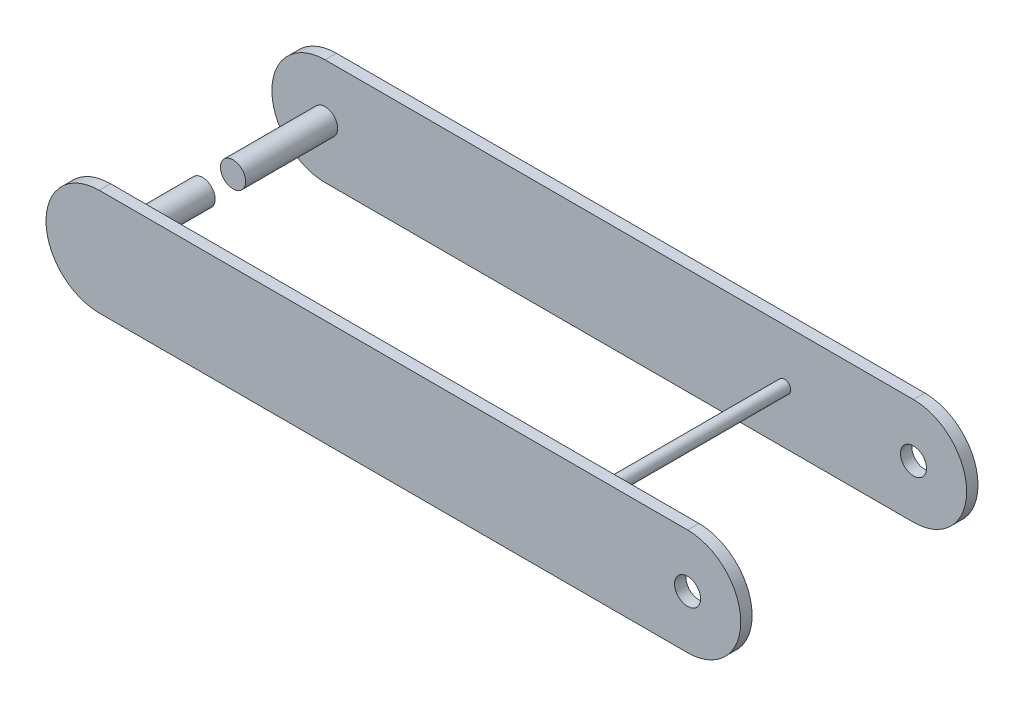
ISO-10303-21;
HEADER;
FILE_DESCRIPTION(('STEP AP214'),'2;1');
FILE_NAME('part.step','',(''),(''),'','','');
FILE_SCHEMA(('AUTOMOTIVE_DESIGN { 1 0 10303 214 1 1 1 1 }'));
ENDSEC;
DATA;
#1=APPLICATION_CONTEXT('core data for automotive mechanical design processes');
#2=APPLICATION_PROTOCOL_DEFINITION('international standard','automotive_design',2000,#1);
#3=PRODUCT_CONTEXT('',#1,'mechanical');
#4=PRODUCT('Part','Part','',(#3));
#5=PRODUCT_RELATED_PRODUCT_CATEGORY('part','',(#4));
#6=PRODUCT_DEFINITION_FORMATION('','',#4);
#7=PRODUCT_DEFINITION_CONTEXT('part definition',#1,'design');
#8=PRODUCT_DEFINITION('design','',#6,#7);
#9=PRODUCT_DEFINITION_SHAPE('','',#8);
#10=(LENGTH_UNIT() NAMED_UNIT(*) SI_UNIT(.MILLI.,.METRE.));
#11=(NAMED_UNIT(*) PLANE_ANGLE_UNIT() SI_UNIT($,.RADIAN.));
#12=(NAMED_UNIT(*) SI_UNIT($,.STERADIAN.) SOLID_ANGLE_UNIT());
#13=UNCERTAINTY_MEASURE_WITH_UNIT(LENGTH_MEASURE(1.E-05),#10,'distance_accuracy_value','');
#14=(GEOMETRIC_REPRESENTATION_CONTEXT(3) GLOBAL_UNCERTAINTY_ASSIGNED_CONTEXT((#13)) GLOBAL_UNIT_ASSIGNED_CONTEXT((#10,
#11,#12)) REPRESENTATION_CONTEXT('',''));
#15=CARTESIAN_POINT('',(0.,0.,0.));
#16=DIRECTION('',(0.,0.,1.));
#17=DIRECTION('',(1.,0.,0.));
#18=AXIS2_PLACEMENT_3D('',#15,#16,#17);
#19=CARTESIAN_POINT('',(-149.578947368421,-25.3,5.4));
#20=DIRECTION('',(0.,0.,1.));
#21=DIRECTION('',(1.,0.,0.));
#22=AXIS2_PLACEMENT_3D('',#19,#20,#21);
#23=PLANE('',#22);
#24=DIRECTION('',(-1.,0.,0.));
#25=VECTOR('',#24,1.);
#26=CARTESIAN_POINT('',(130.421052631579,0.,5.4));
#27=LINE('',#26,#25);
#28=CARTESIAN_POINT('',(130.421052631579,0.,5.4));
#29=VERTEX_POINT('',#28);
#30=CARTESIAN_POINT('',(-149.578947368421,0.,5.4));
#31=VERTEX_POINT('',#30);
#32=EDGE_CURVE('E83',#29,#31,#27,.T.);
#33=ORIENTED_EDGE('',*,*,#32,.T.);
#34=CARTESIAN_POINT('',(-149.578947368421,-25.3,5.4));
#35=DIRECTION('',(0.,0.,1.));
#36=DIRECTION('',(1.,0.,0.));
#37=AXIS2_PLACEMENT_3D('',#34,#35,#36);
#38=CIRCLE('',#37,25.3);
#39=CARTESIAN_POINT('',(-149.578947368421,-50.6,5.4));
#40=VERTEX_POINT('',#39);
#41=EDGE_CURVE('E152',#31,#40,#38,.T.);
#42=ORIENTED_EDGE('',*,*,#41,.T.);
#43=DIRECTION('',(1.,0.,0.));
#44=VECTOR('',#43,1.);
#45=CARTESIAN_POINT('',(-149.578947368421,-50.6,5.4));
#46=LINE('',#45,#44);
#47=CARTESIAN_POINT('',(130.421052631579,-50.6,5.4));
#48=VERTEX_POINT('',#47);
#49=EDGE_CURVE('E155',#40,#48,#46,.T.);
#50=ORIENTED_EDGE('',*,*,#49,.T.);
#51=CARTESIAN_POINT('',(130.421052631579,-25.3,5.4));
#52=DIRECTION('',(0.,0.,1.));
#53=DIRECTION('',(1.,0.,0.));
#54=AXIS2_PLACEMENT_3D('',#51,#52,#53);
#55=CIRCLE('',#54,25.3);
#56=EDGE_CURVE('E53',#48,#29,#55,.T.);
#57=ORIENTED_EDGE('',*,*,#56,.T.);
#58=EDGE_LOOP('',(#33,#42,#50,#57));
#59=FACE_BOUND('',#58,.T.);
#60=CARTESIAN_POINT('',(130.421052631579,-25.3,5.4));
#61=DIRECTION('',(0.,0.,1.));
#62=DIRECTION('',(1.,0.,0.));
#63=AXIS2_PLACEMENT_3D('',#60,#61,#62);
#64=CIRCLE('',#63,6.2);
#65=CARTESIAN_POINT('',(124.221052631579,-25.3,5.4));
#66=VERTEX_POINT('',#65);
#67=EDGE_CURVE('E146',#66,#66,#64,.T.);
#68=ORIENTED_EDGE('',*,*,#67,.F.);
#69=EDGE_LOOP('',(#68));
#70=FACE_BOUND('',#69,.T.);
#71=ADVANCED_FACE('F36',(#59,#70),#23,.T.);
#72=CARTESIAN_POINT('',(-149.578947368421,-25.3,0.));
#73=DIRECTION('',(0.,0.,1.));
#74=DIRECTION('',(1.,0.,0.));
#75=AXIS2_PLACEMENT_3D('',#72,#73,#74);
#76=PLANE('',#75);
#77=CARTESIAN_POINT('',(-149.578947368421,-25.3,0.));
#78=DIRECTION('',(0.,0.,1.));
#79=DIRECTION('',(1.,0.,0.));
#80=AXIS2_PLACEMENT_3D('',#77,#78,#79);
#81=CIRCLE('',#80,6.00000000000002);
#82=CARTESIAN_POINT('',(-143.578947368421,-25.3,0.));
#83=VERTEX_POINT('',#82);
#84=EDGE_CURVE('E329',#83,#83,#81,.T.);
#85=ORIENTED_EDGE('',*,*,#84,.T.);
#86=EDGE_LOOP('',(#85));
#87=FACE_BOUND('',#86,.T.);
#88=CARTESIAN_POINT('',(68.9858099662511,-25.3,0.));
#89=DIRECTION('',(0.,0.,1.));
#90=DIRECTION('',(1.,0.,0.));
#91=AXIS2_PLACEMENT_3D('',#88,#89,#90);
#92=CIRCLE('',#91,2.99999999999999);
#93=CARTESIAN_POINT('',(71.9858099662511,-25.3,0.));
#94=VERTEX_POINT('',#93);
#95=EDGE_CURVE('E11',#94,#94,#92,.F.);
#96=ORIENTED_EDGE('',*,*,#95,.F.);
#97=EDGE_LOOP('',(#96));
#98=FACE_BOUND('',#97,.T.);
#99=DIRECTION('',(-1.,0.,0.));
#100=VECTOR('',#99,1.);
#101=CARTESIAN_POINT('',(0.,0.,0.));
#102=LINE('',#101,#100);
#103=CARTESIAN_POINT('',(130.421052631579,0.,0.));
#104=VERTEX_POINT('',#103);
#105=CARTESIAN_POINT('',(-149.578947368421,0.,0.));
#106=VERTEX_POINT('',#105);
#107=EDGE_CURVE('E78',#104,#106,#102,.T.);
#108=ORIENTED_EDGE('',*,*,#107,.F.);
#109=CARTESIAN_POINT('',(130.421052631579,-25.3,0.));
#110=DIRECTION('',(0.,0.,1.));
#111=DIRECTION('',(1.,0.,0.));
#112=AXIS2_PLACEMENT_3D('',#109,#110,#111);
#113=CIRCLE('',#112,25.3);
#114=CARTESIAN_POINT('',(130.421052631579,-50.6,0.));
#115=VERTEX_POINT('',#114);
#116=EDGE_CURVE('E153',#115,#104,#113,.T.);
#117=ORIENTED_EDGE('',*,*,#116,.F.);
#118=DIRECTION('',(1.,0.,0.));
#119=VECTOR('',#118,1.);
#120=CARTESIAN_POINT('',(-149.578947368421,-50.6,0.));
#121=LINE('',#120,#119);
#122=CARTESIAN_POINT('',(-149.578947368421,-50.6,0.));
#123=VERTEX_POINT('',#122);
#124=EDGE_CURVE('E71',#123,#115,#121,.T.);
#125=ORIENTED_EDGE('',*,*,#124,.F.);
#126=CARTESIAN_POINT('',(-149.578947368421,-25.3,0.));
#127=DIRECTION('',(0.,0.,1.));
#128=DIRECTION('',(1.,0.,0.));
#129=AXIS2_PLACEMENT_3D('',#126,#127,#128);
#130=CIRCLE('',#129,25.3);
#131=EDGE_CURVE('E160',#106,#123,#130,.T.);
#132=ORIENTED_EDGE('',*,*,#131,.F.);
#133=EDGE_LOOP('',(#108,#117,#125,#132));
#134=FACE_BOUND('',#133,.T.);
#135=CARTESIAN_POINT('',(130.421052631579,-25.3,0.));
#136=DIRECTION('',(0.,0.,1.));
#137=DIRECTION('',(1.,0.,0.));
#138=AXIS2_PLACEMENT_3D('',#135,#136,#137);
#139=CIRCLE('',#138,6.2);
#140=CARTESIAN_POINT('',(124.221052631579,-25.3,0.));
#141=VERTEX_POINT('',#140);
#142=EDGE_CURVE('E140',#141,#141,#139,.T.);
#143=ORIENTED_EDGE('',*,*,#142,.T.);
#144=EDGE_LOOP('',(#143));
#145=FACE_BOUND('',#144,.T.);
#146=ADVANCED_FACE('F175',(#87,#98,#134,#145),#76,.F.);
#147=CARTESIAN_POINT('',(0.,0.,5.4));
#148=DIRECTION('',(0.,-1.,0.));
#149=DIRECTION('',(0.,0.,-1.));
#150=AXIS2_PLACEMENT_3D('',#147,#148,#149);
#151=PLANE('',#150);
#152=ORIENTED_EDGE('',*,*,#107,.T.);
#153=DIRECTION('',(0.,0.,-1.));
#154=VECTOR('',#153,1.);
#155=CARTESIAN_POINT('',(-149.578947368421,0.,5.4));
#156=LINE('',#155,#154);
#157=EDGE_CURVE('E45',#31,#106,#156,.T.);
#158=ORIENTED_EDGE('',*,*,#157,.F.);
#159=ORIENTED_EDGE('',*,*,#32,.F.);
#160=DIRECTION('',(0.,0.,-1.));
#161=VECTOR('',#160,1.);
#162=CARTESIAN_POINT('',(130.421052631579,0.,5.4));
#163=LINE('',#162,#161);
#164=EDGE_CURVE('E158',#29,#104,#163,.T.);
#165=ORIENTED_EDGE('',*,*,#164,.T.);
#166=EDGE_LOOP('',(#152,#158,#159,#165));
#167=FACE_BOUND('',#166,.T.);
#168=ADVANCED_FACE('F38',(#167),#151,.F.);
#169=CARTESIAN_POINT('',(-149.578947368421,-25.3,5.4));
#170=DIRECTION('',(0.,0.,-1.));
#171=DIRECTION('',(-1.,0.,0.));
#172=AXIS2_PLACEMENT_3D('',#169,#170,#171);
#173=CYLINDRICAL_SURFACE('',#172,25.3);
#174=ORIENTED_EDGE('',*,*,#131,.T.);
#175=DIRECTION('',(0.,0.,-1.));
#176=VECTOR('',#175,1.);
#177=CARTESIAN_POINT('',(-149.578947368421,-50.6,5.4));
#178=LINE('',#177,#176);
#179=EDGE_CURVE('E168',#40,#123,#178,.T.);
#180=ORIENTED_EDGE('',*,*,#179,.F.);
#181=ORIENTED_EDGE('',*,*,#41,.F.);
#182=ORIENTED_EDGE('',*,*,#157,.T.);
#183=EDGE_LOOP('',(#174,#180,#181,#182));
#184=FACE_BOUND('',#183,.T.);
#185=ADVANCED_FACE('F172',(#184),#173,.T.);
#186=CARTESIAN_POINT('',(-149.578947368421,-50.6,5.4));
#187=DIRECTION('',(0.,1.,0.));
#188=DIRECTION('',(-1.,0.,0.));
#189=AXIS2_PLACEMENT_3D('',#186,#187,#188);
#190=PLANE('',#189);
#191=ORIENTED_EDGE('',*,*,#124,.T.);
#192=DIRECTION('',(0.,0.,-1.));
#193=VECTOR('',#192,1.);
#194=CARTESIAN_POINT('',(130.421052631579,-50.6,5.4));
#195=LINE('',#194,#193);
#196=EDGE_CURVE('E166',#48,#115,#195,.T.);
#197=ORIENTED_EDGE('',*,*,#196,.F.);
#198=ORIENTED_EDGE('',*,*,#49,.F.);
#199=ORIENTED_EDGE('',*,*,#179,.T.);
#200=EDGE_LOOP('',(#191,#197,#198,#199));
#201=FACE_BOUND('',#200,.T.);
#202=ADVANCED_FACE('F184',(#201),#190,.F.);
#203=CARTESIAN_POINT('',(130.421052631579,-25.3,5.4));
#204=DIRECTION('',(0.,0.,-1.));
#205=DIRECTION('',(-1.,0.,0.));
#206=AXIS2_PLACEMENT_3D('',#203,#204,#205);
#207=CYLINDRICAL_SURFACE('',#206,25.3);
#208=ORIENTED_EDGE('',*,*,#116,.T.);
#209=ORIENTED_EDGE('',*,*,#164,.F.);
#210=ORIENTED_EDGE('',*,*,#56,.F.);
#211=ORIENTED_EDGE('',*,*,#196,.T.);
#212=EDGE_LOOP('',(#208,#209,#210,#211));
#213=FACE_BOUND('',#212,.T.);
#214=ADVANCED_FACE('F178',(#213),#207,.T.);
#215=CARTESIAN_POINT('',(130.421052631579,-25.3,5.4));
#216=DIRECTION('',(0.,0.,-1.));
#217=DIRECTION('',(-1.,0.,0.));
#218=AXIS2_PLACEMENT_3D('',#215,#216,#217);
#219=CYLINDRICAL_SURFACE('',#218,6.2);
#220=CARTESIAN_POINT('',(124.221052631579,-25.3,5.4));
#221=CARTESIAN_POINT('',(124.221052631579,-25.3,5.34375));
#222=CARTESIAN_POINT('',(124.221052631579,-25.3,5.2875));
#223=CARTESIAN_POINT('',(124.221052631579,-25.3,5.175));
#224=CARTESIAN_POINT('',(124.221052631579,-25.3,5.11875));
#225=CARTESIAN_POINT('',(124.221052631579,-25.3,5.00625));
#226=CARTESIAN_POINT('',(124.221052631579,-25.3,4.95));
#227=CARTESIAN_POINT('',(124.221052631579,-25.3,4.8375));
#228=CARTESIAN_POINT('',(124.221052631579,-25.3,4.78125));
#229=CARTESIAN_POINT('',(124.221052631579,-25.3,4.66875));
#230=CARTESIAN_POINT('',(124.221052631579,-25.3,4.6125));
#231=CARTESIAN_POINT('',(124.221052631579,-25.3,4.5));
#232=CARTESIAN_POINT('',(124.221052631579,-25.3,4.44375));
#233=CARTESIAN_POINT('',(124.221052631579,-25.3,4.33125));
#234=CARTESIAN_POINT('',(124.221052631579,-25.3,4.275));
#235=CARTESIAN_POINT('',(124.221052631579,-25.3,4.1625));
#236=CARTESIAN_POINT('',(124.221052631579,-25.3,4.10625));
#237=CARTESIAN_POINT('',(124.221052631579,-25.3,3.99375));
#238=CARTESIAN_POINT('',(124.221052631579,-25.3,3.9375));
#239=CARTESIAN_POINT('',(124.221052631579,-25.3,3.825));
#240=CARTESIAN_POINT('',(124.221052631579,-25.3,3.76875));
#241=CARTESIAN_POINT('',(124.221052631579,-25.3,3.65625));
#242=CARTESIAN_POINT('',(124.221052631579,-25.3,3.6));
#243=CARTESIAN_POINT('',(124.221052631579,-25.3,3.4875));
#244=CARTESIAN_POINT('',(124.221052631579,-25.3,3.43125));
#245=CARTESIAN_POINT('',(124.221052631579,-25.3,3.31875));
#246=CARTESIAN_POINT('',(124.221052631579,-25.3,3.2625));
#247=CARTESIAN_POINT('',(124.221052631579,-25.3,3.15));
#248=CARTESIAN_POINT('',(124.221052631579,-25.3,3.09375));
#249=CARTESIAN_POINT('',(124.221052631579,-25.3,2.98125));
#250=CARTESIAN_POINT('',(124.221052631579,-25.3,2.925));
#251=CARTESIAN_POINT('',(124.221052631579,-25.3,2.8125));
#252=CARTESIAN_POINT('',(124.221052631579,-25.3,2.75625));
#253=CARTESIAN_POINT('',(124.221052631579,-25.3,2.64375));
#254=CARTESIAN_POINT('',(124.221052631579,-25.3,2.5875));
#255=CARTESIAN_POINT('',(124.221052631579,-25.3,2.475));
#256=CARTESIAN_POINT('',(124.221052631579,-25.3,2.41875));
#257=CARTESIAN_POINT('',(124.221052631579,-25.3,2.30625));
#258=CARTESIAN_POINT('',(124.221052631579,-25.3,2.25));
#259=CARTESIAN_POINT('',(124.221052631579,-25.3,2.1375));
#260=CARTESIAN_POINT('',(124.221052631579,-25.3,2.08125));
#261=CARTESIAN_POINT('',(124.221052631579,-25.3,1.96875));
#262=CARTESIAN_POINT('',(124.221052631579,-25.3,1.9125));
#263=CARTESIAN_POINT('',(124.221052631579,-25.3,1.8));
#264=CARTESIAN_POINT('',(124.221052631579,-25.3,1.74375));
#265=CARTESIAN_POINT('',(124.221052631579,-25.3,1.63125));
#266=CARTESIAN_POINT('',(124.221052631579,-25.3,1.575));
#267=CARTESIAN_POINT('',(124.221052631579,-25.3,1.4625));
#268=CARTESIAN_POINT('',(124.221052631579,-25.3,1.40625));
#269=CARTESIAN_POINT('',(124.221052631579,-25.3,1.29375));
#270=CARTESIAN_POINT('',(124.221052631579,-25.3,1.2375));
#271=CARTESIAN_POINT('',(124.221052631579,-25.3,1.125));
#272=CARTESIAN_POINT('',(124.221052631579,-25.3,1.06875));
#273=CARTESIAN_POINT('',(124.221052631579,-25.3,0.95625));
#274=CARTESIAN_POINT('',(124.221052631579,-25.3,0.9));
#275=CARTESIAN_POINT('',(124.221052631579,-25.3,0.7875));
#276=CARTESIAN_POINT('',(124.221052631579,-25.3,0.73125));
#277=CARTESIAN_POINT('',(124.221052631579,-25.3,0.618749999999999));
#278=CARTESIAN_POINT('',(124.221052631579,-25.3,0.562499999999999));
#279=CARTESIAN_POINT('',(124.221052631579,-25.3,0.449999999999999));
#280=CARTESIAN_POINT('',(124.221052631579,-25.3,0.393749999999999));
#281=CARTESIAN_POINT('',(124.221052631579,-25.3,0.281249999999999));
#282=CARTESIAN_POINT('',(124.221052631579,-25.3,0.225));
#283=CARTESIAN_POINT('',(124.221052631579,-25.3,0.112499999999999));
#284=CARTESIAN_POINT('',(124.221052631579,-25.3,0.0562499999999992));
#285=CARTESIAN_POINT('',(124.221052631579,-25.3,0.));
#286=B_SPLINE_CURVE_WITH_KNOTS('',3,(#220,#221,#222,#223,#224,#225,#226,#227,#228,#229,#230,
#231,#232,#233,#234,#235,#236,#237,#238,#239,#240,#241,#242,#243,#244,#245,#246,#247,#248,#249,
#250,#251,#252,#253,#254,#255,#256,#257,#258,#259,#260,#261,#262,#263,#264,#265,#266,#267,#268,
#269,#270,#271,#272,#273,#274,#275,#276,#277,#278,#279,#280,#281,#282,#283,#284,#285),
.UNSPECIFIED.,.F.,.F.,(4,2,2,2,2,2,2,2,2,2,2,2,2,2,2,2,2,2,2,2,2,2,2,2,2,2,2,2,2,2,2,2,4),(0.,
0.168750000000001,0.3375,0.506250000000001,0.675,0.843750000000001,1.0125,1.18125,1.35,1.51875,
1.6875,1.85625,2.025,2.19375,2.3625,2.53125,2.7,2.86875,3.0375,3.20625,3.375,3.54375,3.7125,
3.88125,4.05,4.21875,4.3875,4.55625,4.725,4.89375,5.0625,5.23125,5.4),.UNSPECIFIED.);
#287=EDGE_CURVE('BSEAM194',#66,#141,#286,.T.);
#288=ORIENTED_EDGE('',*,*,#67,.T.);
#289=ORIENTED_EDGE('',*,*,#142,.F.);
#290=ORIENTED_EDGE('',*,*,#287,.T.);
#291=ORIENTED_EDGE('',*,*,#287,.F.);
#292=EDGE_LOOP('',(#288,#290,#289,#291));
#293=FACE_BOUND('',#292,.T.);
#294=ADVANCED_FACE('F194',(#293),#219,.F.);
#295=CARTESIAN_POINT('',(68.9858099662511,-25.3,-102.1));
#296=DIRECTION('',(0.,0.,1.));
#297=DIRECTION('',(1.,0.,0.));
#298=AXIS2_PLACEMENT_3D('',#295,#296,#297);
#299=CYLINDRICAL_SURFACE('',#298,2.99999999999999);
#300=CARTESIAN_POINT('',(68.9858099662511,-25.3,-102.1));
#301=DIRECTION('',(0.,0.,-1.));
#302=DIRECTION('',(-1.,0.,0.));
#303=AXIS2_PLACEMENT_3D('',#300,#301,#302);
#304=CIRCLE('',#303,2.99999999999999);
#305=CARTESIAN_POINT('',(65.9858099662511,-25.3,-102.1));
#306=VERTEX_POINT('',#305);
#307=EDGE_CURVE('E137',#306,#306,#304,.T.);
#308=ORIENTED_EDGE('',*,*,#307,.F.);
#309=EDGE_LOOP('',(#308));
#310=FACE_BOUND('',#309,.T.);
#311=ORIENTED_EDGE('',*,*,#95,.T.);
#312=EDGE_LOOP('',(#311));
#313=FACE_BOUND('',#312,.T.);
#314=ADVANCED_FACE('F214',(#310,#313),#299,.T.);
#315=CARTESIAN_POINT('',(130.421052631579,-25.3,-107.5));
#316=DIRECTION('',(0.,0.,1.));
#317=DIRECTION('',(1.,0.,0.));
#318=AXIS2_PLACEMENT_3D('',#315,#316,#317);
#319=PLANE('',#318);
#320=CARTESIAN_POINT('',(130.421052631579,-25.3,-107.5));
#321=DIRECTION('',(0.,0.,-1.));
#322=DIRECTION('',(1.,0.,0.));
#323=AXIS2_PLACEMENT_3D('',#320,#321,#322);
#324=CIRCLE('',#323,25.3);
#325=CARTESIAN_POINT('',(130.421052631579,0.,-107.5));
#326=VERTEX_POINT('',#325);
#327=CARTESIAN_POINT('',(130.421052631579,-50.6,-107.5));
#328=VERTEX_POINT('',#327);
#329=EDGE_CURVE('E122',#326,#328,#324,.T.);
#330=ORIENTED_EDGE('',*,*,#329,.T.);
#331=DIRECTION('',(-1.,0.,0.));
#332=VECTOR('',#331,1.);
#333=CARTESIAN_POINT('',(-149.578947368421,-50.6,-107.5));
#334=LINE('',#333,#332);
#335=CARTESIAN_POINT('',(-149.578947368421,-50.6,-107.5));
#336=VERTEX_POINT('',#335);
#337=EDGE_CURVE('E111',#328,#336,#334,.T.);
#338=ORIENTED_EDGE('',*,*,#337,.T.);
#339=CARTESIAN_POINT('',(-149.578947368421,-25.3,-107.5));
#340=DIRECTION('',(0.,0.,-1.));
#341=DIRECTION('',(1.,0.,0.));
#342=AXIS2_PLACEMENT_3D('',#339,#340,#341);
#343=CIRCLE('',#342,25.3);
#344=CARTESIAN_POINT('',(-149.578947368421,0.,-107.5));
#345=VERTEX_POINT('',#344);
#346=EDGE_CURVE('E121',#336,#345,#343,.T.);
#347=ORIENTED_EDGE('',*,*,#346,.T.);
#348=DIRECTION('',(1.,0.,0.));
#349=VECTOR('',#348,1.);
#350=CARTESIAN_POINT('',(130.421052631579,0.,-107.5));
#351=LINE('',#350,#349);
#352=EDGE_CURVE('E128',#345,#326,#351,.T.);
#353=ORIENTED_EDGE('',*,*,#352,.T.);
#354=EDGE_LOOP('',(#330,#338,#347,#353));
#355=FACE_BOUND('',#354,.T.);
#356=CARTESIAN_POINT('',(130.421052631579,-25.3,-107.5));
#357=DIRECTION('',(0.,0.,-1.));
#358=DIRECTION('',(-1.,0.,0.));
#359=AXIS2_PLACEMENT_3D('',#356,#357,#358);
#360=CIRCLE('',#359,6.2);
#361=CARTESIAN_POINT('',(136.621052631579,-25.3,-107.5));
#362=VERTEX_POINT('',#361);
#363=EDGE_CURVE('E340',#362,#362,#360,.T.);
#364=ORIENTED_EDGE('',*,*,#363,.F.);
#365=EDGE_LOOP('',(#364));
#366=FACE_BOUND('',#365,.T.);
#367=ADVANCED_FACE('F125',(#355,#366),#319,.F.);
#368=CARTESIAN_POINT('',(130.421052631579,-25.3,-102.1));
#369=DIRECTION('',(0.,0.,1.));
#370=DIRECTION('',(1.,0.,0.));
#371=AXIS2_PLACEMENT_3D('',#368,#369,#370);
#372=PLANE('',#371);
#373=CARTESIAN_POINT('',(-149.578947368421,-25.3,-102.1));
#374=DIRECTION('',(0.,0.,1.));
#375=DIRECTION('',(1.,0.,0.));
#376=AXIS2_PLACEMENT_3D('',#373,#374,#375);
#377=CIRCLE('',#376,6.00000000000002);
#378=CARTESIAN_POINT('',(-143.578947368421,-25.3,-102.1));
#379=VERTEX_POINT('',#378);
#380=EDGE_CURVE('E328',#379,#379,#377,.T.);
#381=ORIENTED_EDGE('',*,*,#380,.F.);
#382=EDGE_LOOP('',(#381));
#383=FACE_BOUND('',#382,.T.);
#384=ORIENTED_EDGE('',*,*,#307,.T.);
#385=EDGE_LOOP('',(#384));
#386=FACE_BOUND('',#385,.T.);
#387=CARTESIAN_POINT('',(130.421052631579,-25.3,-102.1));
#388=DIRECTION('',(0.,0.,-1.));
#389=DIRECTION('',(1.,0.,0.));
#390=AXIS2_PLACEMENT_3D('',#387,#388,#389);
#391=CIRCLE('',#390,25.3);
#392=CARTESIAN_POINT('',(130.421052631579,0.,-102.1));
#393=VERTEX_POINT('',#392);
#394=CARTESIAN_POINT('',(130.421052631579,-50.6,-102.1));
#395=VERTEX_POINT('',#394);
#396=EDGE_CURVE('E136',#393,#395,#391,.T.);
#397=ORIENTED_EDGE('',*,*,#396,.F.);
#398=DIRECTION('',(1.,0.,0.));
#399=VECTOR('',#398,1.);
#400=CARTESIAN_POINT('',(130.421052631579,0.,-102.1));
#401=LINE('',#400,#399);
#402=CARTESIAN_POINT('',(-149.578947368421,0.,-102.1));
#403=VERTEX_POINT('',#402);
#404=EDGE_CURVE('E132',#403,#393,#401,.T.);
#405=ORIENTED_EDGE('',*,*,#404,.F.);
#406=CARTESIAN_POINT('',(-149.578947368421,-25.3,-102.1));
#407=DIRECTION('',(0.,0.,-1.));
#408=DIRECTION('',(1.,0.,0.));
#409=AXIS2_PLACEMENT_3D('',#406,#407,#408);
#410=CIRCLE('',#409,25.3);
#411=CARTESIAN_POINT('',(-149.578947368421,-50.6,-102.1));
#412=VERTEX_POINT('',#411);
#413=EDGE_CURVE('E351',#412,#403,#410,.T.);
#414=ORIENTED_EDGE('',*,*,#413,.F.);
#415=DIRECTION('',(-1.,0.,0.));
#416=VECTOR('',#415,1.);
#417=CARTESIAN_POINT('',(-149.578947368421,-50.6,-102.1));
#418=LINE('',#417,#416);
#419=EDGE_CURVE('E349',#395,#412,#418,.T.);
#420=ORIENTED_EDGE('',*,*,#419,.F.);
#421=EDGE_LOOP('',(#397,#405,#414,#420));
#422=FACE_BOUND('',#421,.T.);
#423=CARTESIAN_POINT('',(130.421052631579,-25.3,-102.1));
#424=DIRECTION('',(0.,0.,-1.));
#425=DIRECTION('',(-1.,0.,0.));
#426=AXIS2_PLACEMENT_3D('',#423,#424,#425);
#427=CIRCLE('',#426,6.2);
#428=CARTESIAN_POINT('',(136.621052631579,-25.3,-102.1));
#429=VERTEX_POINT('',#428);
#430=EDGE_CURVE('E338',#429,#429,#427,.T.);
#431=ORIENTED_EDGE('',*,*,#430,.T.);
#432=EDGE_LOOP('',(#431));
#433=FACE_BOUND('',#432,.T.);
#434=ADVANCED_FACE('F227',(#383,#386,#422,#433),#372,.T.);
#435=CARTESIAN_POINT('',(130.421052631579,-25.3,-107.5));
#436=DIRECTION('',(0.,0.,1.));
#437=DIRECTION('',(1.,0.,0.));
#438=AXIS2_PLACEMENT_3D('',#435,#436,#437);
#439=CYLINDRICAL_SURFACE('',#438,25.3);
#440=ORIENTED_EDGE('',*,*,#396,.T.);
#441=DIRECTION('',(0.,0.,1.));
#442=VECTOR('',#441,1.);
#443=CARTESIAN_POINT('',(130.421052631579,-50.6,-107.5));
#444=LINE('',#443,#442);
#445=EDGE_CURVE('E115',#328,#395,#444,.T.);
#446=ORIENTED_EDGE('',*,*,#445,.F.);
#447=ORIENTED_EDGE('',*,*,#329,.F.);
#448=DIRECTION('',(0.,0.,1.));
#449=VECTOR('',#448,1.);
#450=CARTESIAN_POINT('',(130.421052631579,0.,-107.5));
#451=LINE('',#450,#449);
#452=EDGE_CURVE('E347',#326,#393,#451,.T.);
#453=ORIENTED_EDGE('',*,*,#452,.T.);
#454=EDGE_LOOP('',(#440,#446,#447,#453));
#455=FACE_BOUND('',#454,.T.);
#456=ADVANCED_FACE('F134',(#455),#439,.T.);
#457=CARTESIAN_POINT('',(-149.578947368421,-50.6,-107.5));
#458=DIRECTION('',(0.,1.,0.));
#459=DIRECTION('',(-1.,0.,0.));
#460=AXIS2_PLACEMENT_3D('',#457,#458,#459);
#461=PLANE('',#460);
#462=ORIENTED_EDGE('',*,*,#419,.T.);
#463=DIRECTION('',(0.,0.,1.));
#464=VECTOR('',#463,1.);
#465=CARTESIAN_POINT('',(-149.578947368421,-50.6,-107.5));
#466=LINE('',#465,#464);
#467=EDGE_CURVE('E118',#336,#412,#466,.T.);
#468=ORIENTED_EDGE('',*,*,#467,.F.);
#469=ORIENTED_EDGE('',*,*,#337,.F.);
#470=ORIENTED_EDGE('',*,*,#445,.T.);
#471=EDGE_LOOP('',(#462,#468,#469,#470));
#472=FACE_BOUND('',#471,.T.);
#473=ADVANCED_FACE('F113',(#472),#461,.F.);
#474=CARTESIAN_POINT('',(-149.578947368421,-25.3,-107.5));
#475=DIRECTION('',(0.,0.,1.));
#476=DIRECTION('',(1.,0.,0.));
#477=AXIS2_PLACEMENT_3D('',#474,#475,#476);
#478=CYLINDRICAL_SURFACE('',#477,25.3);
#479=ORIENTED_EDGE('',*,*,#413,.T.);
#480=DIRECTION('',(0.,0.,1.));
#481=VECTOR('',#480,1.);
#482=CARTESIAN_POINT('',(-149.578947368421,0.,-107.5));
#483=LINE('',#482,#481);
#484=EDGE_CURVE('E142',#345,#403,#483,.T.);
#485=ORIENTED_EDGE('',*,*,#484,.F.);
#486=ORIENTED_EDGE('',*,*,#346,.F.);
#487=ORIENTED_EDGE('',*,*,#467,.T.);
#488=EDGE_LOOP('',(#479,#485,#486,#487));
#489=FACE_BOUND('',#488,.T.);
#490=ADVANCED_FACE('F251',(#489),#478,.T.);
#491=CARTESIAN_POINT('',(130.421052631579,0.,-107.5));
#492=DIRECTION('',(0.,-1.,0.));
#493=DIRECTION('',(1.,0.,0.));
#494=AXIS2_PLACEMENT_3D('',#491,#492,#493);
#495=PLANE('',#494);
#496=ORIENTED_EDGE('',*,*,#404,.T.);
#497=ORIENTED_EDGE('',*,*,#452,.F.);
#498=ORIENTED_EDGE('',*,*,#352,.F.);
#499=ORIENTED_EDGE('',*,*,#484,.T.);
#500=EDGE_LOOP('',(#496,#497,#498,#499));
#501=FACE_BOUND('',#500,.T.);
#502=ADVANCED_FACE('F258',(#501),#495,.F.);
#503=CARTESIAN_POINT('',(130.421052631579,-25.3,-107.5));
#504=DIRECTION('',(0.,0.,1.));
#505=DIRECTION('',(1.,0.,0.));
#506=AXIS2_PLACEMENT_3D('',#503,#504,#505);
#507=CYLINDRICAL_SURFACE('',#506,6.2);
#508=CARTESIAN_POINT('',(136.621052631579,-25.3,-107.5));
#509=CARTESIAN_POINT('',(136.621052631579,-25.3,-107.44375));
#510=CARTESIAN_POINT('',(136.621052631579,-25.3,-107.3875));
#511=CARTESIAN_POINT('',(136.621052631579,-25.3,-107.275));
#512=CARTESIAN_POINT('',(136.621052631579,-25.3,-107.21875));
#513=CARTESIAN_POINT('',(136.621052631579,-25.3,-107.10625));
#514=CARTESIAN_POINT('',(136.621052631579,-25.3,-107.05));
#515=CARTESIAN_POINT('',(136.621052631579,-25.3,-106.9375));
#516=CARTESIAN_POINT('',(136.621052631579,-25.3,-106.88125));
#517=CARTESIAN_POINT('',(136.621052631579,-25.3,-106.76875));
#518=CARTESIAN_POINT('',(136.621052631579,-25.3,-106.7125));
#519=CARTESIAN_POINT('',(136.621052631579,-25.3,-106.6));
#520=CARTESIAN_POINT('',(136.621052631579,-25.3,-106.54375));
#521=CARTESIAN_POINT('',(136.621052631579,-25.3,-106.43125));
#522=CARTESIAN_POINT('',(136.621052631579,-25.3,-106.375));
#523=CARTESIAN_POINT('',(136.621052631579,-25.3,-106.2625));
#524=CARTESIAN_POINT('',(136.621052631579,-25.3,-106.20625));
#525=CARTESIAN_POINT('',(136.621052631579,-25.3,-106.09375));
#526=CARTESIAN_POINT('',(136.621052631579,-25.3,-106.0375));
#527=CARTESIAN_POINT('',(136.621052631579,-25.3,-105.925));
#528=CARTESIAN_POINT('',(136.621052631579,-25.3,-105.86875));
#529=CARTESIAN_POINT('',(136.621052631579,-25.3,-105.75625));
#530=CARTESIAN_POINT('',(136.621052631579,-25.3,-105.7));
#531=CARTESIAN_POINT('',(136.621052631579,-25.3,-105.5875));
#532=CARTESIAN_POINT('',(136.621052631579,-25.3,-105.53125));
#533=CARTESIAN_POINT('',(136.621052631579,-25.3,-105.41875));
#534=CARTESIAN_POINT('',(136.621052631579,-25.3,-105.3625));
#535=CARTESIAN_POINT('',(136.621052631579,-25.3,-105.25));
#536=CARTESIAN_POINT('',(136.621052631579,-25.3,-105.19375));
#537=CARTESIAN_POINT('',(136.621052631579,-25.3,-105.08125));
#538=CARTESIAN_POINT('',(136.621052631579,-25.3,-105.025));
#539=CARTESIAN_POINT('',(136.621052631579,-25.3,-104.9125));
#540=CARTESIAN_POINT('',(136.621052631579,-25.3,-104.85625));
#541=CARTESIAN_POINT('',(136.621052631579,-25.3,-104.74375));
#542=CARTESIAN_POINT('',(136.621052631579,-25.3,-104.6875));
#543=CARTESIAN_POINT('',(136.621052631579,-25.3,-104.575));
#544=CARTESIAN_POINT('',(136.621052631579,-25.3,-104.51875));
#545=CARTESIAN_POINT('',(136.621052631579,-25.3,-104.40625));
#546=CARTESIAN_POINT('',(136.621052631579,-25.3,-104.35));
#547=CARTESIAN_POINT('',(136.621052631579,-25.3,-104.2375));
#548=CARTESIAN_POINT('',(136.621052631579,-25.3,-104.18125));
#549=CARTESIAN_POINT('',(136.621052631579,-25.3,-104.06875));
#550=CARTESIAN_POINT('',(136.621052631579,-25.3,-104.0125));
#551=CARTESIAN_POINT('',(136.621052631579,-25.3,-103.9));
#552=CARTESIAN_POINT('',(136.621052631579,-25.3,-103.84375));
#553=CARTESIAN_POINT('',(136.621052631579,-25.3,-103.73125));
#554=CARTESIAN_POINT('',(136.621052631579,-25.3,-103.675));
#555=CARTESIAN_POINT('',(136.621052631579,-25.3,-103.5625));
#556=CARTESIAN_POINT('',(136.621052631579,-25.3,-103.50625));
#557=CARTESIAN_POINT('',(136.621052631579,-25.3,-103.39375));
#558=CARTESIAN_POINT('',(136.621052631579,-25.3,-103.3375));
#559=CARTESIAN_POINT('',(136.621052631579,-25.3,-103.225));
#560=CARTESIAN_POINT('',(136.621052631579,-25.3,-103.16875));
#561=CARTESIAN_POINT('',(136.621052631579,-25.3,-103.05625));
#562=CARTESIAN_POINT('',(136.621052631579,-25.3,-103.));
#563=CARTESIAN_POINT('',(136.621052631579,-25.3,-102.8875));
#564=CARTESIAN_POINT('',(136.621052631579,-25.3,-102.83125));
#565=CARTESIAN_POINT('',(136.621052631579,-25.3,-102.71875));
#566=CARTESIAN_POINT('',(136.621052631579,-25.3,-102.6625));
#567=CARTESIAN_POINT('',(136.621052631579,-25.3,-102.55));
#568=CARTESIAN_POINT('',(136.621052631579,-25.3,-102.49375));
#569=CARTESIAN_POINT('',(136.621052631579,-25.3,-102.38125));
#570=CARTESIAN_POINT('',(136.621052631579,-25.3,-102.325));
#571=CARTESIAN_POINT('',(136.621052631579,-25.3,-102.2125));
#572=CARTESIAN_POINT('',(136.621052631579,-25.3,-102.15625));
#573=CARTESIAN_POINT('',(136.621052631579,-25.3,-102.1));
#574=B_SPLINE_CURVE_WITH_KNOTS('',3,(#508,#509,#510,#511,#512,#513,#514,#515,#516,#517,#518,
#519,#520,#521,#522,#523,#524,#525,#526,#527,#528,#529,#530,#531,#532,#533,#534,#535,#536,#537,
#538,#539,#540,#541,#542,#543,#544,#545,#546,#547,#548,#549,#550,#551,#552,#553,#554,#555,#556,
#557,#558,#559,#560,#561,#562,#563,#564,#565,#566,#567,#568,#569,#570,#571,#572,#573),
.UNSPECIFIED.,.F.,.F.,(4,2,2,2,2,2,2,2,2,2,2,2,2,2,2,2,2,2,2,2,2,2,2,2,2,2,2,2,2,2,2,2,4),(0.,
0.168749999999995,0.337499999999991,0.50625,0.674999999999995,0.84374999999999,1.0125,
1.18124999999999,1.34999999999999,1.51875,1.68749999999999,1.85624999999999,2.025,
2.19374999999999,2.36249999999999,2.53125,2.69999999999999,2.86874999999999,3.0375,
3.20624999999999,3.37499999999999,3.54375,3.71249999999999,3.88124999999999,4.05,
4.21874999999999,4.38749999999999,4.55625,4.72499999999999,4.89374999999999,5.0625,
5.23124999999999,5.39999999999999),.UNSPECIFIED.);
#575=EDGE_CURVE('BSEAM266',#362,#429,#574,.T.);
#576=ORIENTED_EDGE('',*,*,#363,.T.);
#577=ORIENTED_EDGE('',*,*,#430,.F.);
#578=ORIENTED_EDGE('',*,*,#575,.T.);
#579=ORIENTED_EDGE('',*,*,#575,.F.);
#580=EDGE_LOOP('',(#576,#578,#577,#579));
#581=FACE_BOUND('',#580,.T.);
#582=ADVANCED_FACE('F266',(#581),#507,.F.);
#583=CARTESIAN_POINT('',(-149.578947368421,-25.3,-58.3));
#584=DIRECTION('',(0.,0.,-1.));
#585=DIRECTION('',(-1.,0.,0.));
#586=AXIS2_PLACEMENT_3D('',#583,#584,#585);
#587=CYLINDRICAL_SURFACE('',#586,6.00000000000002);
#588=CARTESIAN_POINT('',(-149.578947368421,-25.3,-58.3));
#589=DIRECTION('',(0.,0.,1.));
#590=DIRECTION('',(1.,0.,0.));
#591=AXIS2_PLACEMENT_3D('',#588,#589,#590);
#592=CIRCLE('',#591,6.00000000000002);
#593=CARTESIAN_POINT('',(-143.578947368421,-25.3,-58.3));
#594=VERTEX_POINT('',#593);
#595=EDGE_CURVE('E332',#594,#594,#592,.T.);
#596=ORIENTED_EDGE('',*,*,#595,.F.);
#597=EDGE_LOOP('',(#596));
#598=FACE_BOUND('',#597,.T.);
#599=ORIENTED_EDGE('',*,*,#380,.T.);
#600=EDGE_LOOP('',(#599));
#601=FACE_BOUND('',#600,.T.);
#602=ADVANCED_FACE('F273',(#598,#601),#587,.T.);
#603=CARTESIAN_POINT('',(-149.578947368421,-25.3,-58.3));
#604=DIRECTION('',(0.,0.,1.));
#605=DIRECTION('',(1.,0.,0.));
#606=AXIS2_PLACEMENT_3D('',#603,#604,#605);
#607=PLANE('',#606);
#608=ORIENTED_EDGE('',*,*,#595,.T.);
#609=EDGE_LOOP('',(#608));
#610=FACE_BOUND('',#609,.T.);
#611=ADVANCED_FACE('F280',(#610),#607,.T.);
#612=CARTESIAN_POINT('',(-149.578947368421,-25.3,-43.8));
#613=DIRECTION('',(0.,0.,1.));
#614=DIRECTION('',(1.,0.,0.));
#615=AXIS2_PLACEMENT_3D('',#612,#613,#614);
#616=CYLINDRICAL_SURFACE('',#615,6.00000000000002);
#617=CARTESIAN_POINT('',(-149.578947368421,-25.3,-43.8));
#618=DIRECTION('',(0.,0.,1.));
#619=DIRECTION('',(1.,0.,0.));
#620=AXIS2_PLACEMENT_3D('',#617,#618,#619);
#621=CIRCLE('',#620,6.00000000000002);
#622=CARTESIAN_POINT('',(-143.578947368421,-25.3,-43.8));
#623=VERTEX_POINT('',#622);
#624=EDGE_CURVE('E327',#623,#623,#621,.T.);
#625=ORIENTED_EDGE('',*,*,#624,.T.);
#626=EDGE_LOOP('',(#625));
#627=FACE_BOUND('',#626,.T.);
#628=ORIENTED_EDGE('',*,*,#84,.F.);
#629=EDGE_LOOP('',(#628));
#630=FACE_BOUND('',#629,.T.);
#631=ADVANCED_FACE('F288',(#627,#630),#616,.T.);
#632=CARTESIAN_POINT('',(-149.578947368421,-25.3,-43.8));
#633=DIRECTION('',(0.,0.,-1.));
#634=DIRECTION('',(1.,0.,0.));
#635=AXIS2_PLACEMENT_3D('',#632,#633,#634);
#636=PLANE('',#635);
#637=ORIENTED_EDGE('',*,*,#624,.F.);
#638=EDGE_LOOP('',(#637));
#639=FACE_BOUND('',#638,.T.);
#640=ADVANCED_FACE('F296',(#639),#636,.T.);
#641=CLOSED_SHELL('',(#71,#146,#168,#185,#202,#214,#294,#314,#367,#434,#456,#473,#490,#502,#582,
#602,#611,#631,#640));
#642=MANIFOLD_SOLID_BREP('B2',#641);
#643=ADVANCED_BREP_SHAPE_REPRESENTATION('',(#18,#642),#14);
#644=SHAPE_DEFINITION_REPRESENTATION(#9,#643);
ENDSEC;
END-ISO-10303-21;
